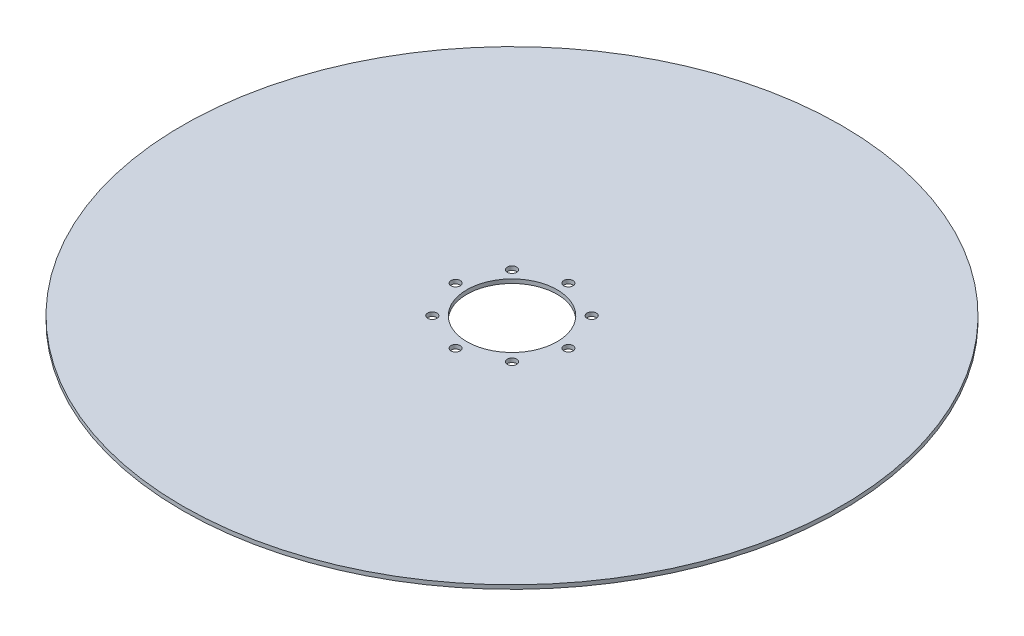
ISO-10303-21;
HEADER;
FILE_DESCRIPTION(('STEP AP214'),'2;1');
FILE_NAME('part.step','',(''),(''),'','','');
FILE_SCHEMA(('AUTOMOTIVE_DESIGN { 1 0 10303 214 1 1 1 1 }'));
ENDSEC;
DATA;
#1=APPLICATION_CONTEXT('core data for automotive mechanical design processes');
#2=APPLICATION_PROTOCOL_DEFINITION('international standard','automotive_design',2000,#1);
#3=PRODUCT_CONTEXT('',#1,'mechanical');
#4=PRODUCT('Part','Part','',(#3));
#5=PRODUCT_RELATED_PRODUCT_CATEGORY('part','',(#4));
#6=PRODUCT_DEFINITION_FORMATION('','',#4);
#7=PRODUCT_DEFINITION_CONTEXT('part definition',#1,'design');
#8=PRODUCT_DEFINITION('design','',#6,#7);
#9=PRODUCT_DEFINITION_SHAPE('','',#8);
#10=(LENGTH_UNIT() NAMED_UNIT(*) SI_UNIT(.MILLI.,.METRE.));
#11=(NAMED_UNIT(*) PLANE_ANGLE_UNIT() SI_UNIT($,.RADIAN.));
#12=(NAMED_UNIT(*) SI_UNIT($,.STERADIAN.) SOLID_ANGLE_UNIT());
#13=UNCERTAINTY_MEASURE_WITH_UNIT(LENGTH_MEASURE(1.E-05),#10,'distance_accuracy_value','');
#14=(GEOMETRIC_REPRESENTATION_CONTEXT(3) GLOBAL_UNCERTAINTY_ASSIGNED_CONTEXT((#13)) GLOBAL_UNIT_ASSIGNED_CONTEXT((#10,
#11,#12)) REPRESENTATION_CONTEXT('',''));
#15=CARTESIAN_POINT('',(0.,0.,0.));
#16=DIRECTION('',(0.,0.,1.));
#17=DIRECTION('',(1.,0.,0.));
#18=AXIS2_PLACEMENT_3D('',#15,#16,#17);
#19=CARTESIAN_POINT('',(0.,0.75,0.));
#20=DIRECTION('',(0.,1.,0.));
#21=DIRECTION('',(0.,0.,1.));
#22=AXIS2_PLACEMENT_3D('',#19,#20,#21);
#23=PLANE('',#22);
#24=CARTESIAN_POINT('',(21.25,0.75,0.));
#25=DIRECTION('',(0.,1.,0.));
#26=DIRECTION('',(0.,0.,1.));
#27=AXIS2_PLACEMENT_3D('',#24,#25,#26);
#28=CIRCLE('',#27,1.75);
#29=CARTESIAN_POINT('',(21.25,0.75,1.75));
#30=VERTEX_POINT('',#29);
#31=EDGE_CURVE('E83',#30,#30,#28,.T.);
#32=ORIENTED_EDGE('',*,*,#31,.F.);
#33=EDGE_LOOP('',(#32));
#34=FACE_BOUND('',#33,.T.);
#35=CARTESIAN_POINT('',(0.,0.75,-21.25));
#36=DIRECTION('',(0.,1.,0.));
#37=DIRECTION('',(0.,0.,1.));
#38=AXIS2_PLACEMENT_3D('',#35,#36,#37);
#39=CIRCLE('',#38,1.75);
#40=CARTESIAN_POINT('',(0.,0.75,-19.5));
#41=VERTEX_POINT('',#40);
#42=EDGE_CURVE('E71',#41,#41,#39,.T.);
#43=ORIENTED_EDGE('',*,*,#42,.F.);
#44=EDGE_LOOP('',(#43));
#45=FACE_BOUND('',#44,.T.);
#46=CARTESIAN_POINT('',(-21.25,0.75,0.));
#47=DIRECTION('',(0.,1.,0.));
#48=DIRECTION('',(0.,0.,1.));
#49=AXIS2_PLACEMENT_3D('',#46,#47,#48);
#50=CIRCLE('',#49,1.75);
#51=CARTESIAN_POINT('',(-21.25,0.75,1.75));
#52=VERTEX_POINT('',#51);
#53=EDGE_CURVE('E59',#52,#52,#50,.T.);
#54=ORIENTED_EDGE('',*,*,#53,.F.);
#55=EDGE_LOOP('',(#54));
#56=FACE_BOUND('',#55,.T.);
#57=CARTESIAN_POINT('',(0.,0.75,21.25));
#58=DIRECTION('',(0.,1.,0.));
#59=DIRECTION('',(0.,0.,1.));
#60=AXIS2_PLACEMENT_3D('',#57,#58,#59);
#61=CIRCLE('',#60,1.75);
#62=CARTESIAN_POINT('',(0.,0.75,23.));
#63=VERTEX_POINT('',#62);
#64=EDGE_CURVE('E47',#63,#63,#61,.T.);
#65=ORIENTED_EDGE('',*,*,#64,.F.);
#66=EDGE_LOOP('',(#65));
#67=FACE_BOUND('',#66,.T.);
#68=CARTESIAN_POINT('',(0.,0.75,0.));
#69=DIRECTION('',(0.,1.,0.));
#70=DIRECTION('',(0.,0.,1.));
#71=AXIS2_PLACEMENT_3D('',#68,#69,#70);
#72=CIRCLE('',#71,124.25);
#73=CARTESIAN_POINT('',(0.,0.75,124.25));
#74=VERTEX_POINT('',#73);
#75=EDGE_CURVE('E10',#74,#74,#72,.T.);
#76=ORIENTED_EDGE('',*,*,#75,.T.);
#77=EDGE_LOOP('',(#76));
#78=FACE_BOUND('',#77,.T.);
#79=CARTESIAN_POINT('',(0.,0.75,0.));
#80=DIRECTION('',(0.,1.,0.));
#81=DIRECTION('',(0.,0.,1.));
#82=AXIS2_PLACEMENT_3D('',#79,#80,#81);
#83=CIRCLE('',#82,17.);
#84=CARTESIAN_POINT('',(0.,0.75,17.));
#85=VERTEX_POINT('',#84);
#86=EDGE_CURVE('E42',#85,#85,#83,.T.);
#87=ORIENTED_EDGE('',*,*,#86,.F.);
#88=EDGE_LOOP('',(#87));
#89=FACE_BOUND('',#88,.T.);
#90=CARTESIAN_POINT('',(-15.0260191002145,0.75,15.0260191002138));
#91=DIRECTION('',(0.,1.,0.));
#92=DIRECTION('',(0.,0.,1.));
#93=AXIS2_PLACEMENT_3D('',#90,#91,#92);
#94=CIRCLE('',#93,1.75);
#95=CARTESIAN_POINT('',(-15.0260191002145,0.75,16.7760191002138));
#96=VERTEX_POINT('',#95);
#97=EDGE_CURVE('E53',#96,#96,#94,.T.);
#98=ORIENTED_EDGE('',*,*,#97,.F.);
#99=EDGE_LOOP('',(#98));
#100=FACE_BOUND('',#99,.T.);
#101=CARTESIAN_POINT('',(-15.0260191002142,0.75,-15.0260191002141));
#102=DIRECTION('',(0.,1.,0.));
#103=DIRECTION('',(0.,0.,1.));
#104=AXIS2_PLACEMENT_3D('',#101,#102,#103);
#105=CIRCLE('',#104,1.75);
#106=CARTESIAN_POINT('',(-15.0260191002142,0.75,-13.2760191002141));
#107=VERTEX_POINT('',#106);
#108=EDGE_CURVE('E65',#107,#107,#105,.T.);
#109=ORIENTED_EDGE('',*,*,#108,.F.);
#110=EDGE_LOOP('',(#109));
#111=FACE_BOUND('',#110,.T.);
#112=CARTESIAN_POINT('',(15.0260191002142,0.75,-15.0260191002141));
#113=DIRECTION('',(0.,1.,0.));
#114=DIRECTION('',(0.,0.,1.));
#115=AXIS2_PLACEMENT_3D('',#112,#113,#114);
#116=CIRCLE('',#115,1.75);
#117=CARTESIAN_POINT('',(15.0260191002142,0.75,-13.2760191002141));
#118=VERTEX_POINT('',#117);
#119=EDGE_CURVE('E77',#118,#118,#116,.T.);
#120=ORIENTED_EDGE('',*,*,#119,.F.);
#121=EDGE_LOOP('',(#120));
#122=FACE_BOUND('',#121,.T.);
#123=CARTESIAN_POINT('',(15.0260191002145,0.75,15.0260191002137));
#124=DIRECTION('',(0.,1.,0.));
#125=DIRECTION('',(0.,0.,1.));
#126=AXIS2_PLACEMENT_3D('',#123,#124,#125);
#127=CIRCLE('',#126,1.75);
#128=CARTESIAN_POINT('',(15.0260191002145,0.75,16.7760191002137));
#129=VERTEX_POINT('',#128);
#130=EDGE_CURVE('E89',#129,#129,#127,.T.);
#131=ORIENTED_EDGE('',*,*,#130,.F.);
#132=EDGE_LOOP('',(#131));
#133=FACE_BOUND('',#132,.T.);
#134=ADVANCED_FACE('F31',(#34,#45,#56,#67,#78,#89,#100,#111,#122,#133),#23,.T.);
#135=CARTESIAN_POINT('',(0.,-0.75,0.));
#136=DIRECTION('',(0.,1.,0.));
#137=DIRECTION('',(0.,0.,1.));
#138=AXIS2_PLACEMENT_3D('',#135,#136,#137);
#139=PLANE('',#138);
#140=CARTESIAN_POINT('',(0.,-0.75,0.));
#141=DIRECTION('',(0.,1.,0.));
#142=DIRECTION('',(0.,0.,1.));
#143=AXIS2_PLACEMENT_3D('',#140,#141,#142);
#144=CIRCLE('',#143,124.25);
#145=CARTESIAN_POINT('',(0.,-0.75,124.25));
#146=VERTEX_POINT('',#145);
#147=EDGE_CURVE('E35',#146,#146,#144,.T.);
#148=ORIENTED_EDGE('',*,*,#147,.F.);
#149=EDGE_LOOP('',(#148));
#150=FACE_BOUND('',#149,.T.);
#151=CARTESIAN_POINT('',(0.,-0.75,0.));
#152=DIRECTION('',(0.,1.,0.));
#153=DIRECTION('',(0.,0.,1.));
#154=AXIS2_PLACEMENT_3D('',#151,#152,#153);
#155=CIRCLE('',#154,17.);
#156=CARTESIAN_POINT('',(0.,-0.75,17.));
#157=VERTEX_POINT('',#156);
#158=EDGE_CURVE('E44',#157,#157,#155,.T.);
#159=ORIENTED_EDGE('',*,*,#158,.T.);
#160=EDGE_LOOP('',(#159));
#161=FACE_BOUND('',#160,.T.);
#162=CARTESIAN_POINT('',(0.,-0.75,21.25));
#163=DIRECTION('',(0.,1.,0.));
#164=DIRECTION('',(0.,0.,1.));
#165=AXIS2_PLACEMENT_3D('',#162,#163,#164);
#166=CIRCLE('',#165,1.75);
#167=CARTESIAN_POINT('',(0.,-0.75,23.));
#168=VERTEX_POINT('',#167);
#169=EDGE_CURVE('E50',#168,#168,#166,.T.);
#170=ORIENTED_EDGE('',*,*,#169,.T.);
#171=EDGE_LOOP('',(#170));
#172=FACE_BOUND('',#171,.T.);
#173=CARTESIAN_POINT('',(-15.0260191002145,-0.75,15.0260191002138));
#174=DIRECTION('',(0.,1.,0.));
#175=DIRECTION('',(0.,0.,1.));
#176=AXIS2_PLACEMENT_3D('',#173,#174,#175);
#177=CIRCLE('',#176,1.75);
#178=CARTESIAN_POINT('',(-15.0260191002145,-0.75,16.7760191002138));
#179=VERTEX_POINT('',#178);
#180=EDGE_CURVE('E56',#179,#179,#177,.T.);
#181=ORIENTED_EDGE('',*,*,#180,.T.);
#182=EDGE_LOOP('',(#181));
#183=FACE_BOUND('',#182,.T.);
#184=CARTESIAN_POINT('',(-21.25,-0.75,0.));
#185=DIRECTION('',(0.,1.,0.));
#186=DIRECTION('',(0.,0.,1.));
#187=AXIS2_PLACEMENT_3D('',#184,#185,#186);
#188=CIRCLE('',#187,1.75);
#189=CARTESIAN_POINT('',(-21.25,-0.75,1.75));
#190=VERTEX_POINT('',#189);
#191=EDGE_CURVE('E62',#190,#190,#188,.T.);
#192=ORIENTED_EDGE('',*,*,#191,.T.);
#193=EDGE_LOOP('',(#192));
#194=FACE_BOUND('',#193,.T.);
#195=CARTESIAN_POINT('',(-15.0260191002142,-0.75,-15.0260191002141));
#196=DIRECTION('',(0.,1.,0.));
#197=DIRECTION('',(0.,0.,1.));
#198=AXIS2_PLACEMENT_3D('',#195,#196,#197);
#199=CIRCLE('',#198,1.75);
#200=CARTESIAN_POINT('',(-15.0260191002142,-0.75,-13.2760191002141));
#201=VERTEX_POINT('',#200);
#202=EDGE_CURVE('E68',#201,#201,#199,.T.);
#203=ORIENTED_EDGE('',*,*,#202,.T.);
#204=EDGE_LOOP('',(#203));
#205=FACE_BOUND('',#204,.T.);
#206=CARTESIAN_POINT('',(0.,-0.75,-21.25));
#207=DIRECTION('',(0.,1.,0.));
#208=DIRECTION('',(0.,0.,1.));
#209=AXIS2_PLACEMENT_3D('',#206,#207,#208);
#210=CIRCLE('',#209,1.75);
#211=CARTESIAN_POINT('',(0.,-0.75,-19.5));
#212=VERTEX_POINT('',#211);
#213=EDGE_CURVE('E74',#212,#212,#210,.T.);
#214=ORIENTED_EDGE('',*,*,#213,.T.);
#215=EDGE_LOOP('',(#214));
#216=FACE_BOUND('',#215,.T.);
#217=CARTESIAN_POINT('',(15.0260191002142,-0.75,-15.0260191002141));
#218=DIRECTION('',(0.,1.,0.));
#219=DIRECTION('',(0.,0.,1.));
#220=AXIS2_PLACEMENT_3D('',#217,#218,#219);
#221=CIRCLE('',#220,1.75);
#222=CARTESIAN_POINT('',(15.0260191002142,-0.75,-13.2760191002141));
#223=VERTEX_POINT('',#222);
#224=EDGE_CURVE('E80',#223,#223,#221,.T.);
#225=ORIENTED_EDGE('',*,*,#224,.T.);
#226=EDGE_LOOP('',(#225));
#227=FACE_BOUND('',#226,.T.);
#228=CARTESIAN_POINT('',(21.25,-0.75,0.));
#229=DIRECTION('',(0.,1.,0.));
#230=DIRECTION('',(0.,0.,1.));
#231=AXIS2_PLACEMENT_3D('',#228,#229,#230);
#232=CIRCLE('',#231,1.75);
#233=CARTESIAN_POINT('',(21.25,-0.75,1.75));
#234=VERTEX_POINT('',#233);
#235=EDGE_CURVE('E86',#234,#234,#232,.T.);
#236=ORIENTED_EDGE('',*,*,#235,.T.);
#237=EDGE_LOOP('',(#236));
#238=FACE_BOUND('',#237,.T.);
#239=CARTESIAN_POINT('',(15.0260191002145,-0.75,15.0260191002137));
#240=DIRECTION('',(0.,1.,0.));
#241=DIRECTION('',(0.,0.,1.));
#242=AXIS2_PLACEMENT_3D('',#239,#240,#241);
#243=CIRCLE('',#242,1.75);
#244=CARTESIAN_POINT('',(15.0260191002145,-0.75,16.7760191002137));
#245=VERTEX_POINT('',#244);
#246=EDGE_CURVE('E92',#245,#245,#243,.T.);
#247=ORIENTED_EDGE('',*,*,#246,.T.);
#248=EDGE_LOOP('',(#247));
#249=FACE_BOUND('',#248,.T.);
#250=ADVANCED_FACE('F102',(#150,#161,#172,#183,#194,#205,#216,#227,#238,#249),#139,.F.);
#251=CARTESIAN_POINT('',(0.,0.75,0.));
#252=DIRECTION('',(0.,-1.,0.));
#253=DIRECTION('',(0.,0.,-1.));
#254=AXIS2_PLACEMENT_3D('',#251,#252,#253);
#255=CYLINDRICAL_SURFACE('',#254,124.25);
#256=ORIENTED_EDGE('',*,*,#75,.F.);
#257=EDGE_LOOP('',(#256));
#258=FACE_BOUND('',#257,.T.);
#259=ORIENTED_EDGE('',*,*,#147,.T.);
#260=EDGE_LOOP('',(#259));
#261=FACE_BOUND('',#260,.T.);
#262=ADVANCED_FACE('F33',(#258,#261),#255,.T.);
#263=CARTESIAN_POINT('',(0.,0.75,0.));
#264=DIRECTION('',(0.,-1.,0.));
#265=DIRECTION('',(0.,0.,-1.));
#266=AXIS2_PLACEMENT_3D('',#263,#264,#265);
#267=CYLINDRICAL_SURFACE('',#266,17.);
#268=ORIENTED_EDGE('',*,*,#86,.T.);
#269=EDGE_LOOP('',(#268));
#270=FACE_BOUND('',#269,.T.);
#271=ORIENTED_EDGE('',*,*,#158,.F.);
#272=EDGE_LOOP('',(#271));
#273=FACE_BOUND('',#272,.T.);
#274=ADVANCED_FACE('F112',(#270,#273),#267,.F.);
#275=CARTESIAN_POINT('',(0.,0.75,21.25));
#276=DIRECTION('',(0.,-1.,0.));
#277=DIRECTION('',(0.,0.,-1.));
#278=AXIS2_PLACEMENT_3D('',#275,#276,#277);
#279=CYLINDRICAL_SURFACE('',#278,1.75);
#280=ORIENTED_EDGE('',*,*,#64,.T.);
#281=EDGE_LOOP('',(#280));
#282=FACE_BOUND('',#281,.T.);
#283=ORIENTED_EDGE('',*,*,#169,.F.);
#284=EDGE_LOOP('',(#283));
#285=FACE_BOUND('',#284,.T.);
#286=ADVANCED_FACE('F115',(#282,#285),#279,.F.);
#287=CARTESIAN_POINT('',(-15.0260191002145,0.75,15.0260191002138));
#288=DIRECTION('',(0.,-1.,0.));
#289=DIRECTION('',(0.,0.,-1.));
#290=AXIS2_PLACEMENT_3D('',#287,#288,#289);
#291=CYLINDRICAL_SURFACE('',#290,1.75);
#292=ORIENTED_EDGE('',*,*,#97,.T.);
#293=EDGE_LOOP('',(#292));
#294=FACE_BOUND('',#293,.T.);
#295=ORIENTED_EDGE('',*,*,#180,.F.);
#296=EDGE_LOOP('',(#295));
#297=FACE_BOUND('',#296,.T.);
#298=ADVANCED_FACE('F119',(#294,#297),#291,.F.);
#299=CARTESIAN_POINT('',(-21.25,0.75,0.));
#300=DIRECTION('',(0.,-1.,0.));
#301=DIRECTION('',(0.,0.,-1.));
#302=AXIS2_PLACEMENT_3D('',#299,#300,#301);
#303=CYLINDRICAL_SURFACE('',#302,1.75);
#304=ORIENTED_EDGE('',*,*,#53,.T.);
#305=EDGE_LOOP('',(#304));
#306=FACE_BOUND('',#305,.T.);
#307=ORIENTED_EDGE('',*,*,#191,.F.);
#308=EDGE_LOOP('',(#307));
#309=FACE_BOUND('',#308,.T.);
#310=ADVANCED_FACE('F123',(#306,#309),#303,.F.);
#311=CARTESIAN_POINT('',(-15.0260191002142,0.75,-15.0260191002141));
#312=DIRECTION('',(0.,-1.,0.));
#313=DIRECTION('',(0.,0.,-1.));
#314=AXIS2_PLACEMENT_3D('',#311,#312,#313);
#315=CYLINDRICAL_SURFACE('',#314,1.75);
#316=ORIENTED_EDGE('',*,*,#108,.T.);
#317=EDGE_LOOP('',(#316));
#318=FACE_BOUND('',#317,.T.);
#319=ORIENTED_EDGE('',*,*,#202,.F.);
#320=EDGE_LOOP('',(#319));
#321=FACE_BOUND('',#320,.T.);
#322=ADVANCED_FACE('F127',(#318,#321),#315,.F.);
#323=CARTESIAN_POINT('',(0.,0.75,-21.25));
#324=DIRECTION('',(0.,-1.,0.));
#325=DIRECTION('',(0.,0.,-1.));
#326=AXIS2_PLACEMENT_3D('',#323,#324,#325);
#327=CYLINDRICAL_SURFACE('',#326,1.75);
#328=ORIENTED_EDGE('',*,*,#42,.T.);
#329=EDGE_LOOP('',(#328));
#330=FACE_BOUND('',#329,.T.);
#331=ORIENTED_EDGE('',*,*,#213,.F.);
#332=EDGE_LOOP('',(#331));
#333=FACE_BOUND('',#332,.T.);
#334=ADVANCED_FACE('F131',(#330,#333),#327,.F.);
#335=CARTESIAN_POINT('',(15.0260191002142,0.75,-15.0260191002141));
#336=DIRECTION('',(0.,-1.,0.));
#337=DIRECTION('',(0.,0.,-1.));
#338=AXIS2_PLACEMENT_3D('',#335,#336,#337);
#339=CYLINDRICAL_SURFACE('',#338,1.75);
#340=ORIENTED_EDGE('',*,*,#119,.T.);
#341=EDGE_LOOP('',(#340));
#342=FACE_BOUND('',#341,.T.);
#343=ORIENTED_EDGE('',*,*,#224,.F.);
#344=EDGE_LOOP('',(#343));
#345=FACE_BOUND('',#344,.T.);
#346=ADVANCED_FACE('F135',(#342,#345),#339,.F.);
#347=CARTESIAN_POINT('',(21.25,0.75,0.));
#348=DIRECTION('',(0.,-1.,0.));
#349=DIRECTION('',(0.,0.,-1.));
#350=AXIS2_PLACEMENT_3D('',#347,#348,#349);
#351=CYLINDRICAL_SURFACE('',#350,1.75);
#352=ORIENTED_EDGE('',*,*,#31,.T.);
#353=EDGE_LOOP('',(#352));
#354=FACE_BOUND('',#353,.T.);
#355=ORIENTED_EDGE('',*,*,#235,.F.);
#356=EDGE_LOOP('',(#355));
#357=FACE_BOUND('',#356,.T.);
#358=ADVANCED_FACE('F139',(#354,#357),#351,.F.);
#359=CARTESIAN_POINT('',(15.0260191002145,0.75,15.0260191002137));
#360=DIRECTION('',(0.,-1.,0.));
#361=DIRECTION('',(0.,0.,-1.));
#362=AXIS2_PLACEMENT_3D('',#359,#360,#361);
#363=CYLINDRICAL_SURFACE('',#362,1.75);
#364=ORIENTED_EDGE('',*,*,#130,.T.);
#365=EDGE_LOOP('',(#364));
#366=FACE_BOUND('',#365,.T.);
#367=ORIENTED_EDGE('',*,*,#246,.F.);
#368=EDGE_LOOP('',(#367));
#369=FACE_BOUND('',#368,.T.);
#370=ADVANCED_FACE('F98',(#366,#369),#363,.F.);
#371=CLOSED_SHELL('',(#134,#250,#262,#274,#286,#298,#310,#322,#334,#346,#358,#370));
#372=MANIFOLD_SOLID_BREP('B2',#371);
#373=ADVANCED_BREP_SHAPE_REPRESENTATION('',(#18,#372),#14);
#374=SHAPE_DEFINITION_REPRESENTATION(#9,#373);
ENDSEC;
END-ISO-10303-21;
